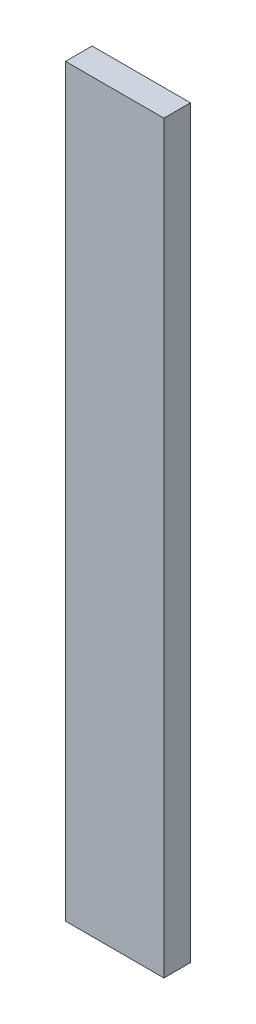
ISO-10303-21;
HEADER;
FILE_DESCRIPTION(('STEP AP214'),'2;1');
FILE_NAME('part.step','',(''),(''),'','','');
FILE_SCHEMA(('AUTOMOTIVE_DESIGN { 1 0 10303 214 1 1 1 1 }'));
ENDSEC;
DATA;
#1=APPLICATION_CONTEXT('core data for automotive mechanical design processes');
#2=APPLICATION_PROTOCOL_DEFINITION('international standard','automotive_design',2000,#1);
#3=PRODUCT_CONTEXT('',#1,'mechanical');
#4=PRODUCT('Part','Part','',(#3));
#5=PRODUCT_RELATED_PRODUCT_CATEGORY('part','',(#4));
#6=PRODUCT_DEFINITION_FORMATION('','',#4);
#7=PRODUCT_DEFINITION_CONTEXT('part definition',#1,'design');
#8=PRODUCT_DEFINITION('design','',#6,#7);
#9=PRODUCT_DEFINITION_SHAPE('','',#8);
#10=(LENGTH_UNIT() NAMED_UNIT(*) SI_UNIT(.MILLI.,.METRE.));
#11=(NAMED_UNIT(*) PLANE_ANGLE_UNIT() SI_UNIT($,.RADIAN.));
#12=(NAMED_UNIT(*) SI_UNIT($,.STERADIAN.) SOLID_ANGLE_UNIT());
#13=UNCERTAINTY_MEASURE_WITH_UNIT(LENGTH_MEASURE(1.E-05),#10,'distance_accuracy_value','');
#14=(GEOMETRIC_REPRESENTATION_CONTEXT(3) GLOBAL_UNCERTAINTY_ASSIGNED_CONTEXT((#13)) GLOBAL_UNIT_ASSIGNED_CONTEXT((#10,
#11,#12)) REPRESENTATION_CONTEXT('',''));
#15=CARTESIAN_POINT('',(0.,0.,0.));
#16=DIRECTION('',(0.,0.,1.));
#17=DIRECTION('',(1.,0.,0.));
#18=AXIS2_PLACEMENT_3D('',#15,#16,#17);
#19=CARTESIAN_POINT('',(9.346348110465,0.7,0.05));
#20=DIRECTION('',(0.,0.,1.));
#21=DIRECTION('',(1.,0.,0.));
#22=AXIS2_PLACEMENT_3D('',#19,#20,#21);
#23=PLANE('',#22);
#24=DIRECTION('',(0.,1.,0.));
#25=VECTOR('',#24,1.);
#26=CARTESIAN_POINT('',(9.253824491279,0.,0.05));
#27=LINE('',#26,#25);
#28=CARTESIAN_POINT('',(9.253824491279,0.,0.05));
#29=VERTEX_POINT('',#28);
#30=CARTESIAN_POINT('',(9.253824491279,1.4,0.05));
#31=VERTEX_POINT('',#30);
#32=EDGE_CURVE('E21',#29,#31,#27,.T.);
#33=ORIENTED_EDGE('',*,*,#32,.F.);
#34=DIRECTION('',(-1.,0.,0.));
#35=VECTOR('',#34,1.);
#36=CARTESIAN_POINT('',(9.438871729651,0.,0.05));
#37=LINE('',#36,#35);
#38=CARTESIAN_POINT('',(9.438871729651,0.,0.05));
#39=VERTEX_POINT('',#38);
#40=EDGE_CURVE('E74',#39,#29,#37,.T.);
#41=ORIENTED_EDGE('',*,*,#40,.F.);
#42=DIRECTION('',(0.,-1.,0.));
#43=VECTOR('',#42,1.);
#44=CARTESIAN_POINT('',(9.438871729651,1.4,0.05));
#45=LINE('',#44,#43);
#46=CARTESIAN_POINT('',(9.438871729651,1.4,0.05));
#47=VERTEX_POINT('',#46);
#48=EDGE_CURVE('E61',#47,#39,#45,.T.);
#49=ORIENTED_EDGE('',*,*,#48,.F.);
#50=DIRECTION('',(1.,0.,0.));
#51=VECTOR('',#50,1.);
#52=CARTESIAN_POINT('',(9.253824491279,1.4,0.05));
#53=LINE('',#52,#51);
#54=EDGE_CURVE('E28',#31,#47,#53,.T.);
#55=ORIENTED_EDGE('',*,*,#54,.F.);
#56=EDGE_LOOP('',(#33,#41,#49,#55));
#57=FACE_BOUND('',#56,.T.);
#58=ADVANCED_FACE('F17',(#57),#23,.T.);
#59=CARTESIAN_POINT('',(9.346348110465,0.7,0.));
#60=DIRECTION('',(0.,0.,1.));
#61=DIRECTION('',(1.,0.,0.));
#62=AXIS2_PLACEMENT_3D('',#59,#60,#61);
#63=PLANE('',#62);
#64=DIRECTION('',(1.,0.,0.));
#65=VECTOR('',#64,1.);
#66=CARTESIAN_POINT('',(9.253824491279,1.4,0.));
#67=LINE('',#66,#65);
#68=CARTESIAN_POINT('',(9.253824491279,1.4,0.));
#69=VERTEX_POINT('',#68);
#70=CARTESIAN_POINT('',(9.438871729651,1.4,0.));
#71=VERTEX_POINT('',#70);
#72=EDGE_CURVE('E11',#69,#71,#67,.T.);
#73=ORIENTED_EDGE('',*,*,#72,.T.);
#74=DIRECTION('',(0.,-1.,0.));
#75=VECTOR('',#74,1.);
#76=CARTESIAN_POINT('',(9.438871729651,1.4,0.));
#77=LINE('',#76,#75);
#78=CARTESIAN_POINT('',(9.438871729651,0.,0.));
#79=VERTEX_POINT('',#78);
#80=EDGE_CURVE('E70',#71,#79,#77,.T.);
#81=ORIENTED_EDGE('',*,*,#80,.T.);
#82=DIRECTION('',(-1.,0.,0.));
#83=VECTOR('',#82,1.);
#84=CARTESIAN_POINT('',(9.438871729651,0.,0.));
#85=LINE('',#84,#83);
#86=CARTESIAN_POINT('',(9.253824491279,0.,0.));
#87=VERTEX_POINT('',#86);
#88=EDGE_CURVE('E81',#79,#87,#85,.T.);
#89=ORIENTED_EDGE('',*,*,#88,.T.);
#90=DIRECTION('',(0.,1.,0.));
#91=VECTOR('',#90,1.);
#92=CARTESIAN_POINT('',(9.253824491279,0.,0.));
#93=LINE('',#92,#91);
#94=EDGE_CURVE('E87',#87,#69,#93,.T.);
#95=ORIENTED_EDGE('',*,*,#94,.T.);
#96=EDGE_LOOP('',(#73,#81,#89,#95));
#97=FACE_BOUND('',#96,.T.);
#98=ADVANCED_FACE('F19',(#97),#63,.F.);
#99=CARTESIAN_POINT('',(9.253824491279,1.4,0.));
#100=DIRECTION('',(0.,1.,0.));
#101=DIRECTION('',(1.,0.,0.));
#102=AXIS2_PLACEMENT_3D('',#99,#100,#101);
#103=PLANE('',#102);
#104=DIRECTION('',(0.,0.,1.));
#105=VECTOR('',#104,1.);
#106=CARTESIAN_POINT('',(9.253824491279,1.4,0.));
#107=LINE('',#106,#105);
#108=EDGE_CURVE('E93',#69,#31,#107,.T.);
#109=ORIENTED_EDGE('',*,*,#108,.T.);
#110=ORIENTED_EDGE('',*,*,#54,.T.);
#111=DIRECTION('',(0.,0.,1.));
#112=VECTOR('',#111,1.);
#113=CARTESIAN_POINT('',(9.438871729651,1.4,0.));
#114=LINE('',#113,#112);
#115=EDGE_CURVE('E67',#71,#47,#114,.T.);
#116=ORIENTED_EDGE('',*,*,#115,.F.);
#117=ORIENTED_EDGE('',*,*,#72,.F.);
#118=EDGE_LOOP('',(#109,#110,#116,#117));
#119=FACE_BOUND('',#118,.T.);
#120=ADVANCED_FACE('F136',(#119),#103,.T.);
#121=CARTESIAN_POINT('',(9.438871729651,1.4,0.));
#122=DIRECTION('',(1.,0.,0.));
#123=DIRECTION('',(0.,1.,0.));
#124=AXIS2_PLACEMENT_3D('',#121,#122,#123);
#125=PLANE('',#124);
#126=ORIENTED_EDGE('',*,*,#115,.T.);
#127=ORIENTED_EDGE('',*,*,#48,.T.);
#128=DIRECTION('',(0.,0.,1.));
#129=VECTOR('',#128,1.);
#130=CARTESIAN_POINT('',(9.438871729651,0.,0.));
#131=LINE('',#130,#129);
#132=EDGE_CURVE('E66',#79,#39,#131,.T.);
#133=ORIENTED_EDGE('',*,*,#132,.F.);
#134=ORIENTED_EDGE('',*,*,#80,.F.);
#135=EDGE_LOOP('',(#126,#127,#133,#134));
#136=FACE_BOUND('',#135,.T.);
#137=ADVANCED_FACE('F63',(#136),#125,.T.);
#138=CARTESIAN_POINT('',(9.438871729651,0.,0.));
#139=DIRECTION('',(0.,-1.,0.));
#140=DIRECTION('',(0.,0.,-1.));
#141=AXIS2_PLACEMENT_3D('',#138,#139,#140);
#142=PLANE('',#141);
#143=ORIENTED_EDGE('',*,*,#132,.T.);
#144=ORIENTED_EDGE('',*,*,#40,.T.);
#145=DIRECTION('',(0.,0.,1.));
#146=VECTOR('',#145,1.);
#147=CARTESIAN_POINT('',(9.253824491279,0.,0.));
#148=LINE('',#147,#146);
#149=EDGE_CURVE('E107',#87,#29,#148,.T.);
#150=ORIENTED_EDGE('',*,*,#149,.F.);
#151=ORIENTED_EDGE('',*,*,#88,.F.);
#152=EDGE_LOOP('',(#143,#144,#150,#151));
#153=FACE_BOUND('',#152,.T.);
#154=ADVANCED_FACE('F84',(#153),#142,.T.);
#155=CARTESIAN_POINT('',(9.253824491279,0.,0.));
#156=DIRECTION('',(-1.,0.,0.));
#157=DIRECTION('',(0.,0.,1.));
#158=AXIS2_PLACEMENT_3D('',#155,#156,#157);
#159=PLANE('',#158);
#160=ORIENTED_EDGE('',*,*,#149,.T.);
#161=ORIENTED_EDGE('',*,*,#32,.T.);
#162=ORIENTED_EDGE('',*,*,#108,.F.);
#163=ORIENTED_EDGE('',*,*,#94,.F.);
#164=EDGE_LOOP('',(#160,#161,#162,#163));
#165=FACE_BOUND('',#164,.T.);
#166=ADVANCED_FACE('F122',(#165),#159,.T.);
#167=CLOSED_SHELL('',(#58,#98,#120,#137,#154,#166));
#168=MANIFOLD_SOLID_BREP('B1',#167);
#169=ADVANCED_BREP_SHAPE_REPRESENTATION('',(#18,#168),#14);
#170=SHAPE_DEFINITION_REPRESENTATION(#9,#169);
ENDSEC;
END-ISO-10303-21;
